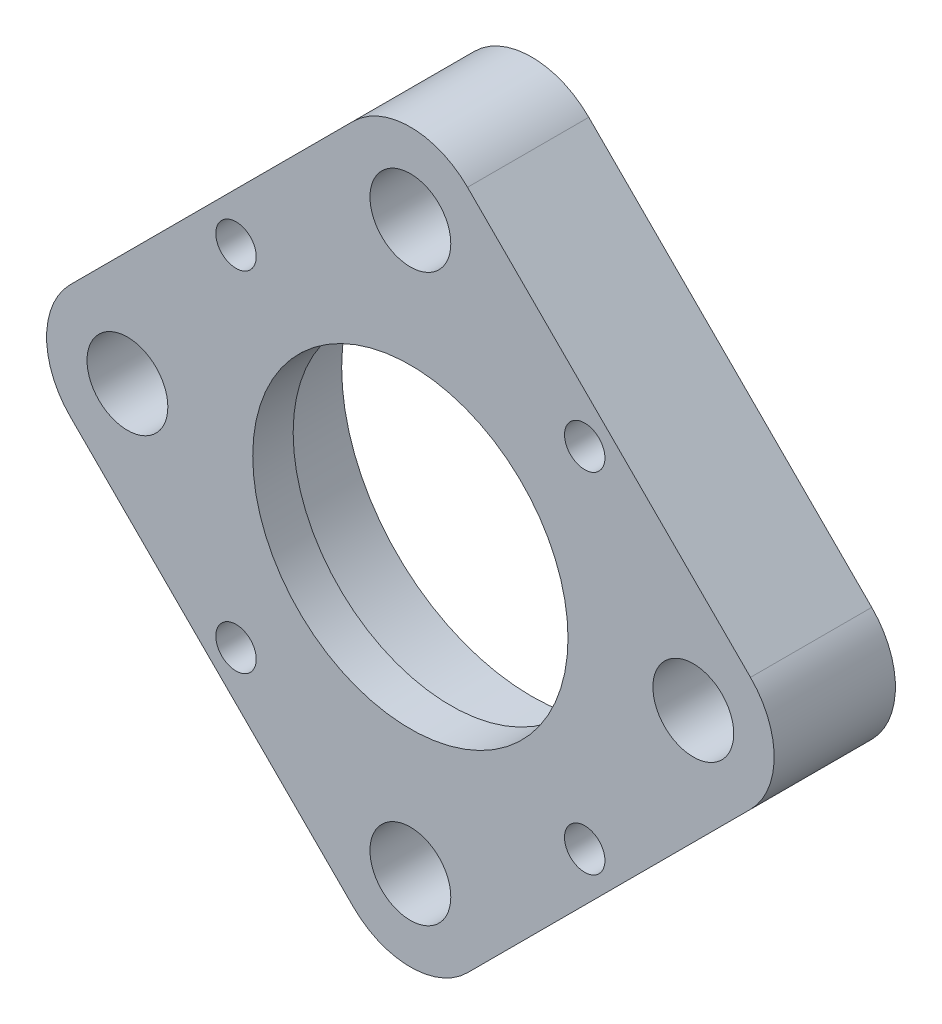
ISO-10303-21;
HEADER;
FILE_DESCRIPTION(('STEP AP214'),'2;1');
FILE_NAME('part.step','',(''),(''),'','','');
FILE_SCHEMA(('AUTOMOTIVE_DESIGN { 1 0 10303 214 1 1 1 1 }'));
ENDSEC;
DATA;
#1=APPLICATION_CONTEXT('core data for automotive mechanical design processes');
#2=APPLICATION_PROTOCOL_DEFINITION('international standard','automotive_design',2000,#1);
#3=PRODUCT_CONTEXT('',#1,'mechanical');
#4=PRODUCT('Part','Part','',(#3));
#5=PRODUCT_RELATED_PRODUCT_CATEGORY('part','',(#4));
#6=PRODUCT_DEFINITION_FORMATION('','',#4);
#7=PRODUCT_DEFINITION_CONTEXT('part definition',#1,'design');
#8=PRODUCT_DEFINITION('design','',#6,#7);
#9=PRODUCT_DEFINITION_SHAPE('','',#8);
#10=(LENGTH_UNIT() NAMED_UNIT(*) SI_UNIT(.MILLI.,.METRE.));
#11=(NAMED_UNIT(*) PLANE_ANGLE_UNIT() SI_UNIT($,.RADIAN.));
#12=(NAMED_UNIT(*) SI_UNIT($,.STERADIAN.) SOLID_ANGLE_UNIT());
#13=UNCERTAINTY_MEASURE_WITH_UNIT(LENGTH_MEASURE(1.E-05),#10,'distance_accuracy_value','');
#14=(GEOMETRIC_REPRESENTATION_CONTEXT(3) GLOBAL_UNCERTAINTY_ASSIGNED_CONTEXT((#13)) GLOBAL_UNIT_ASSIGNED_CONTEXT((#10,
#11,#12)) REPRESENTATION_CONTEXT('',''));
#15=CARTESIAN_POINT('',(0.,0.,0.));
#16=DIRECTION('',(0.,0.,1.));
#17=DIRECTION('',(1.,0.,0.));
#18=AXIS2_PLACEMENT_3D('',#15,#16,#17);
#19=CARTESIAN_POINT('',(-35.,0.,5.));
#20=DIRECTION('',(0.,0.,-1.));
#21=DIRECTION('',(-1.,0.,0.));
#22=AXIS2_PLACEMENT_3D('',#19,#20,#21);
#23=CYLINDRICAL_SURFACE('',#22,10.);
#24=CARTESIAN_POINT('',(-35.,0.,-10.));
#25=DIRECTION('',(0.,0.,-1.));
#26=DIRECTION('',(-1.,0.,0.));
#27=AXIS2_PLACEMENT_3D('',#24,#25,#26);
#28=CIRCLE('',#27,10.);
#29=CARTESIAN_POINT('',(-42.0710678118655,-7.07106781186547,-10.));
#30=VERTEX_POINT('',#29);
#31=CARTESIAN_POINT('',(-42.0710678118655,7.07106781186547,-10.));
#32=VERTEX_POINT('',#31);
#33=EDGE_CURVE('E114',#30,#32,#28,.T.);
#34=ORIENTED_EDGE('',*,*,#33,.F.);
#35=DIRECTION('',(0.,0.,-1.));
#36=VECTOR('',#35,1.);
#37=CARTESIAN_POINT('',(-42.0710678118655,-7.07106781186546,5.));
#38=LINE('',#37,#36);
#39=CARTESIAN_POINT('',(-42.0710678118655,-7.07106781186546,5.));
#40=VERTEX_POINT('',#39);
#41=EDGE_CURVE('E101',#40,#30,#38,.T.);
#42=ORIENTED_EDGE('',*,*,#41,.F.);
#43=CARTESIAN_POINT('',(-35.,0.,5.));
#44=DIRECTION('',(0.,0.,-1.));
#45=DIRECTION('',(-1.,0.,0.));
#46=AXIS2_PLACEMENT_3D('',#43,#44,#45);
#47=CIRCLE('',#46,10.);
#48=CARTESIAN_POINT('',(-42.0710678118655,7.07106781186547,5.));
#49=VERTEX_POINT('',#48);
#50=EDGE_CURVE('E112',#40,#49,#47,.T.);
#51=ORIENTED_EDGE('',*,*,#50,.T.);
#52=DIRECTION('',(0.,0.,-1.));
#53=VECTOR('',#52,1.);
#54=CARTESIAN_POINT('',(-42.0710678118655,7.07106781186547,5.));
#55=LINE('',#54,#53);
#56=EDGE_CURVE('E206',#49,#32,#55,.T.);
#57=ORIENTED_EDGE('',*,*,#56,.T.);
#58=EDGE_LOOP('',(#34,#42,#51,#57));
#59=FACE_BOUND('',#58,.T.);
#60=ADVANCED_FACE('F35',(#59),#23,.T.);
#61=CARTESIAN_POINT('',(0.,-35.,5.));
#62=DIRECTION('',(0.,0.,-1.));
#63=DIRECTION('',(-1.,0.,0.));
#64=AXIS2_PLACEMENT_3D('',#61,#62,#63);
#65=CYLINDRICAL_SURFACE('',#64,10.);
#66=DIRECTION('',(0.,0.,-1.));
#67=VECTOR('',#66,1.);
#68=CARTESIAN_POINT('',(-7.07106781186548,-42.0710678118655,5.));
#69=LINE('',#68,#67);
#70=CARTESIAN_POINT('',(-7.07106781186548,-42.0710678118655,5.));
#71=VERTEX_POINT('',#70);
#72=CARTESIAN_POINT('',(-7.07106781186548,-42.0710678118655,-10.));
#73=VERTEX_POINT('',#72);
#74=EDGE_CURVE('E104',#71,#73,#69,.T.);
#75=ORIENTED_EDGE('',*,*,#74,.T.);
#76=CARTESIAN_POINT('',(0.,-35.,-10.));
#77=DIRECTION('',(0.,0.,-1.));
#78=DIRECTION('',(-1.,0.,0.));
#79=AXIS2_PLACEMENT_3D('',#76,#77,#78);
#80=CIRCLE('',#79,10.);
#81=CARTESIAN_POINT('',(7.07106781186547,-42.0710678118655,-10.));
#82=VERTEX_POINT('',#81);
#83=EDGE_CURVE('E131',#82,#73,#80,.T.);
#84=ORIENTED_EDGE('',*,*,#83,.F.);
#85=DIRECTION('',(0.,0.,-1.));
#86=VECTOR('',#85,1.);
#87=CARTESIAN_POINT('',(7.07106781186546,-42.0710678118655,5.));
#88=LINE('',#87,#86);
#89=CARTESIAN_POINT('',(7.07106781186546,-42.0710678118655,5.));
#90=VERTEX_POINT('',#89);
#91=EDGE_CURVE('E572',#90,#82,#88,.T.);
#92=ORIENTED_EDGE('',*,*,#91,.F.);
#93=CARTESIAN_POINT('',(0.,-35.,5.));
#94=DIRECTION('',(0.,0.,-1.));
#95=DIRECTION('',(-1.,0.,0.));
#96=AXIS2_PLACEMENT_3D('',#93,#94,#95);
#97=CIRCLE('',#96,10.);
#98=EDGE_CURVE('E133',#90,#71,#97,.T.);
#99=ORIENTED_EDGE('',*,*,#98,.T.);
#100=EDGE_LOOP('',(#75,#84,#92,#99));
#101=FACE_BOUND('',#100,.T.);
#102=ADVANCED_FACE('F164',(#101),#65,.T.);
#103=CARTESIAN_POINT('',(35.,0.,5.));
#104=DIRECTION('',(0.,0.,-1.));
#105=DIRECTION('',(-1.,0.,0.));
#106=AXIS2_PLACEMENT_3D('',#103,#104,#105);
#107=CYLINDRICAL_SURFACE('',#106,10.);
#108=DIRECTION('',(0.,0.,-1.));
#109=VECTOR('',#108,1.);
#110=CARTESIAN_POINT('',(42.0710678118655,-7.07106781186546,5.));
#111=LINE('',#110,#109);
#112=CARTESIAN_POINT('',(42.0710678118655,-7.07106781186546,5.));
#113=VERTEX_POINT('',#112);
#114=CARTESIAN_POINT('',(42.0710678118655,-7.07106781186546,-10.));
#115=VERTEX_POINT('',#114);
#116=EDGE_CURVE('E570',#113,#115,#111,.T.);
#117=ORIENTED_EDGE('',*,*,#116,.T.);
#118=CARTESIAN_POINT('',(35.,0.,-10.));
#119=DIRECTION('',(0.,0.,-1.));
#120=DIRECTION('',(-1.,0.,0.));
#121=AXIS2_PLACEMENT_3D('',#118,#119,#120);
#122=CIRCLE('',#121,10.);
#123=CARTESIAN_POINT('',(42.0710678118655,7.07106781186548,-10.));
#124=VERTEX_POINT('',#123);
#125=EDGE_CURVE('E121',#124,#115,#122,.T.);
#126=ORIENTED_EDGE('',*,*,#125,.F.);
#127=DIRECTION('',(0.,0.,-1.));
#128=VECTOR('',#127,1.);
#129=CARTESIAN_POINT('',(42.0710678118655,7.07106781186547,5.));
#130=LINE('',#129,#128);
#131=CARTESIAN_POINT('',(42.0710678118655,7.07106781186547,5.));
#132=VERTEX_POINT('',#131);
#133=EDGE_CURVE('E579',#132,#124,#130,.T.);
#134=ORIENTED_EDGE('',*,*,#133,.F.);
#135=CARTESIAN_POINT('',(35.,0.,5.));
#136=DIRECTION('',(0.,0.,-1.));
#137=DIRECTION('',(-1.,0.,0.));
#138=AXIS2_PLACEMENT_3D('',#135,#136,#137);
#139=CIRCLE('',#138,10.);
#140=EDGE_CURVE('E123',#132,#113,#139,.T.);
#141=ORIENTED_EDGE('',*,*,#140,.T.);
#142=EDGE_LOOP('',(#117,#126,#134,#141));
#143=FACE_BOUND('',#142,.T.);
#144=ADVANCED_FACE('F169',(#143),#107,.T.);
#145=CARTESIAN_POINT('',(0.,35.,5.));
#146=DIRECTION('',(0.,0.,-1.));
#147=DIRECTION('',(-1.,0.,0.));
#148=AXIS2_PLACEMENT_3D('',#145,#146,#147);
#149=CYLINDRICAL_SURFACE('',#148,10.);
#150=DIRECTION('',(0.,0.,-1.));
#151=VECTOR('',#150,1.);
#152=CARTESIAN_POINT('',(7.07106781186546,42.0710678118655,5.));
#153=LINE('',#152,#151);
#154=CARTESIAN_POINT('',(7.07106781186546,42.0710678118655,5.));
#155=VERTEX_POINT('',#154);
#156=CARTESIAN_POINT('',(7.07106781186546,42.0710678118655,-10.));
#157=VERTEX_POINT('',#156);
#158=EDGE_CURVE('E188',#155,#157,#153,.T.);
#159=ORIENTED_EDGE('',*,*,#158,.T.);
#160=CARTESIAN_POINT('',(0.,35.,-10.));
#161=DIRECTION('',(0.,0.,-1.));
#162=DIRECTION('',(-1.,0.,0.));
#163=AXIS2_PLACEMENT_3D('',#160,#161,#162);
#164=CIRCLE('',#163,10.);
#165=CARTESIAN_POINT('',(-7.07106781186547,42.0710678118655,-10.));
#166=VERTEX_POINT('',#165);
#167=EDGE_CURVE('E135',#166,#157,#164,.T.);
#168=ORIENTED_EDGE('',*,*,#167,.F.);
#169=DIRECTION('',(0.,0.,-1.));
#170=VECTOR('',#169,1.);
#171=CARTESIAN_POINT('',(-7.07106781186546,42.0710678118655,5.));
#172=LINE('',#171,#170);
#173=CARTESIAN_POINT('',(-7.07106781186546,42.0710678118655,5.));
#174=VERTEX_POINT('',#173);
#175=EDGE_CURVE('E191',#174,#166,#172,.T.);
#176=ORIENTED_EDGE('',*,*,#175,.F.);
#177=CARTESIAN_POINT('',(0.,35.,5.));
#178=DIRECTION('',(0.,0.,-1.));
#179=DIRECTION('',(-1.,0.,0.));
#180=AXIS2_PLACEMENT_3D('',#177,#178,#179);
#181=CIRCLE('',#180,10.);
#182=EDGE_CURVE('E137',#174,#155,#181,.T.);
#183=ORIENTED_EDGE('',*,*,#182,.T.);
#184=EDGE_LOOP('',(#159,#168,#176,#183));
#185=FACE_BOUND('',#184,.T.);
#186=ADVANCED_FACE('F176',(#185),#149,.T.);
#187=CARTESIAN_POINT('',(0.,0.,0.));
#188=DIRECTION('',(0.,0.,1.));
#189=DIRECTION('',(1.,0.,0.));
#190=AXIS2_PLACEMENT_3D('',#187,#188,#189);
#191=PLANE('',#190);
#192=CARTESIAN_POINT('',(0.,0.,0.));
#193=DIRECTION('',(0.,0.,1.));
#194=DIRECTION('',(1.,0.,0.));
#195=AXIS2_PLACEMENT_3D('',#192,#193,#194);
#196=CIRCLE('',#195,19.5);
#197=CARTESIAN_POINT('',(19.5,0.,0.));
#198=VERTEX_POINT('',#197);
#199=EDGE_CURVE('E39',#198,#198,#196,.T.);
#200=ORIENTED_EDGE('',*,*,#199,.T.);
#201=EDGE_LOOP('',(#200));
#202=FACE_BOUND('',#201,.T.);
#203=CARTESIAN_POINT('',(0.,0.,0.));
#204=DIRECTION('',(0.,0.,-1.));
#205=DIRECTION('',(-1.,0.,0.));
#206=AXIS2_PLACEMENT_3D('',#203,#204,#205);
#207=CIRCLE('',#206,23.5);
#208=CARTESIAN_POINT('',(-23.5,0.,0.));
#209=VERTEX_POINT('',#208);
#210=EDGE_CURVE('E140',#209,#209,#207,.T.);
#211=ORIENTED_EDGE('',*,*,#210,.T.);
#212=EDGE_LOOP('',(#211));
#213=FACE_BOUND('',#212,.T.);
#214=ADVANCED_FACE('F149',(#202,#213),#191,.F.);
#215=CARTESIAN_POINT('',(0.,0.,5.));
#216=DIRECTION('',(0.,0.,-1.));
#217=DIRECTION('',(-1.,0.,0.));
#218=AXIS2_PLACEMENT_3D('',#215,#216,#217);
#219=CYLINDRICAL_SURFACE('',#218,19.5);
#220=CARTESIAN_POINT('',(0.,0.,5.));
#221=DIRECTION('',(0.,0.,1.));
#222=DIRECTION('',(1.,0.,0.));
#223=AXIS2_PLACEMENT_3D('',#220,#221,#222);
#224=CIRCLE('',#223,19.5);
#225=CARTESIAN_POINT('',(19.5,0.,5.));
#226=VERTEX_POINT('',#225);
#227=EDGE_CURVE('E12',#226,#226,#224,.T.);
#228=ORIENTED_EDGE('',*,*,#227,.T.);
#229=EDGE_LOOP('',(#228));
#230=FACE_BOUND('',#229,.T.);
#231=ORIENTED_EDGE('',*,*,#199,.F.);
#232=EDGE_LOOP('',(#231));
#233=FACE_BOUND('',#232,.T.);
#234=ADVANCED_FACE('F37',(#230,#233),#219,.F.);
#235=CARTESIAN_POINT('',(0.,0.,5.));
#236=DIRECTION('',(0.,0.,1.));
#237=DIRECTION('',(1.,0.,0.));
#238=AXIS2_PLACEMENT_3D('',#235,#236,#237);
#239=PLANE('',#238);
#240=ORIENTED_EDGE('',*,*,#182,.F.);
#241=DIRECTION('',(-0.707106781186548,-0.707106781186547,0.));
#242=VECTOR('',#241,1.);
#243=CARTESIAN_POINT('',(-24.5710678118655,24.5710678118655,5.));
#244=LINE('',#243,#242);
#245=EDGE_CURVE('E119',#174,#49,#244,.T.);
#246=ORIENTED_EDGE('',*,*,#245,.T.);
#247=ORIENTED_EDGE('',*,*,#50,.F.);
#248=DIRECTION('',(0.707106781186547,-0.707106781186548,0.));
#249=VECTOR('',#248,1.);
#250=CARTESIAN_POINT('',(-24.5710678118655,-24.5710678118655,5.));
#251=LINE('',#250,#249);
#252=EDGE_CURVE('E98',#40,#71,#251,.T.);
#253=ORIENTED_EDGE('',*,*,#252,.T.);
#254=ORIENTED_EDGE('',*,*,#98,.F.);
#255=DIRECTION('',(0.707106781186548,0.707106781186548,0.));
#256=VECTOR('',#255,1.);
#257=CARTESIAN_POINT('',(24.5710678118655,-24.5710678118655,5.));
#258=LINE('',#257,#256);
#259=EDGE_CURVE('E574',#90,#113,#258,.T.);
#260=ORIENTED_EDGE('',*,*,#259,.T.);
#261=ORIENTED_EDGE('',*,*,#140,.F.);
#262=DIRECTION('',(-0.707106781186548,0.707106781186547,0.));
#263=VECTOR('',#262,1.);
#264=CARTESIAN_POINT('',(24.5710678118655,24.5710678118655,5.));
#265=LINE('',#264,#263);
#266=EDGE_CURVE('E192',#132,#155,#265,.T.);
#267=ORIENTED_EDGE('',*,*,#266,.T.);
#268=EDGE_LOOP('',(#240,#246,#247,#253,#254,#260,#261,#267));
#269=FACE_BOUND('',#268,.T.);
#270=CARTESIAN_POINT('',(-21.5667568261898,21.5667568261896,5.));
#271=DIRECTION('',(0.,0.,1.));
#272=DIRECTION('',(1.,0.,0.));
#273=AXIS2_PLACEMENT_3D('',#270,#271,#272);
#274=CIRCLE('',#273,2.49999999999999);
#275=CARTESIAN_POINT('',(-19.0667568261898,21.5667568261896,5.));
#276=VERTEX_POINT('',#275);
#277=EDGE_CURVE('E209',#276,#276,#274,.T.);
#278=ORIENTED_EDGE('',*,*,#277,.F.);
#279=EDGE_LOOP('',(#278));
#280=FACE_BOUND('',#279,.T.);
#281=CARTESIAN_POINT('',(21.5667568261898,21.5667568261896,5.));
#282=DIRECTION('',(0.,0.,1.));
#283=DIRECTION('',(1.,0.,0.));
#284=AXIS2_PLACEMENT_3D('',#281,#282,#283);
#285=CIRCLE('',#284,2.49999999999999);
#286=CARTESIAN_POINT('',(24.0667568261898,21.5667568261896,5.));
#287=VERTEX_POINT('',#286);
#288=EDGE_CURVE('E215',#287,#287,#285,.T.);
#289=ORIENTED_EDGE('',*,*,#288,.F.);
#290=EDGE_LOOP('',(#289));
#291=FACE_BOUND('',#290,.T.);
#292=CARTESIAN_POINT('',(21.5667568261898,-21.5667568261896,5.));
#293=DIRECTION('',(0.,0.,1.));
#294=DIRECTION('',(1.,0.,0.));
#295=AXIS2_PLACEMENT_3D('',#292,#293,#294);
#296=CIRCLE('',#295,2.49999999999999);
#297=CARTESIAN_POINT('',(24.0667568261898,-21.5667568261896,5.));
#298=VERTEX_POINT('',#297);
#299=EDGE_CURVE('E221',#298,#298,#296,.T.);
#300=ORIENTED_EDGE('',*,*,#299,.F.);
#301=EDGE_LOOP('',(#300));
#302=FACE_BOUND('',#301,.T.);
#303=CARTESIAN_POINT('',(-21.5667568261898,-21.5667568261896,5.));
#304=DIRECTION('',(0.,0.,1.));
#305=DIRECTION('',(1.,0.,0.));
#306=AXIS2_PLACEMENT_3D('',#303,#304,#305);
#307=CIRCLE('',#306,2.49999999999999);
#308=CARTESIAN_POINT('',(-19.0667568261898,-21.5667568261896,5.));
#309=VERTEX_POINT('',#308);
#310=EDGE_CURVE('E227',#309,#309,#307,.T.);
#311=ORIENTED_EDGE('',*,*,#310,.F.);
#312=EDGE_LOOP('',(#311));
#313=FACE_BOUND('',#312,.T.);
#314=CARTESIAN_POINT('',(0.,35.,5.));
#315=DIRECTION('',(0.,0.,1.));
#316=DIRECTION('',(1.,0.,0.));
#317=AXIS2_PLACEMENT_3D('',#314,#315,#316);
#318=CIRCLE('',#317,5.);
#319=CARTESIAN_POINT('',(5.,35.,5.));
#320=VERTEX_POINT('',#319);
#321=EDGE_CURVE('E233',#320,#320,#318,.T.);
#322=ORIENTED_EDGE('',*,*,#321,.F.);
#323=EDGE_LOOP('',(#322));
#324=FACE_BOUND('',#323,.T.);
#325=CARTESIAN_POINT('',(0.,-35.,5.));
#326=DIRECTION('',(0.,0.,1.));
#327=DIRECTION('',(1.,0.,0.));
#328=AXIS2_PLACEMENT_3D('',#325,#326,#327);
#329=CIRCLE('',#328,5.);
#330=CARTESIAN_POINT('',(5.,-35.,5.));
#331=VERTEX_POINT('',#330);
#332=EDGE_CURVE('E239',#331,#331,#329,.T.);
#333=ORIENTED_EDGE('',*,*,#332,.F.);
#334=EDGE_LOOP('',(#333));
#335=FACE_BOUND('',#334,.T.);
#336=CARTESIAN_POINT('',(-35.,0.,5.));
#337=DIRECTION('',(0.,0.,1.));
#338=DIRECTION('',(1.,0.,0.));
#339=AXIS2_PLACEMENT_3D('',#336,#337,#338);
#340=CIRCLE('',#339,5.);
#341=CARTESIAN_POINT('',(-30.,0.,5.));
#342=VERTEX_POINT('',#341);
#343=EDGE_CURVE('E245',#342,#342,#340,.T.);
#344=ORIENTED_EDGE('',*,*,#343,.F.);
#345=EDGE_LOOP('',(#344));
#346=FACE_BOUND('',#345,.T.);
#347=CARTESIAN_POINT('',(35.,0.,5.));
#348=DIRECTION('',(0.,0.,1.));
#349=DIRECTION('',(1.,0.,0.));
#350=AXIS2_PLACEMENT_3D('',#347,#348,#349);
#351=CIRCLE('',#350,5.);
#352=CARTESIAN_POINT('',(40.,0.,5.));
#353=VERTEX_POINT('',#352);
#354=EDGE_CURVE('E250',#353,#353,#351,.T.);
#355=ORIENTED_EDGE('',*,*,#354,.F.);
#356=EDGE_LOOP('',(#355));
#357=FACE_BOUND('',#356,.T.);
#358=ORIENTED_EDGE('',*,*,#227,.F.);
#359=EDGE_LOOP('',(#358));
#360=FACE_BOUND('',#359,.T.);
#361=ADVANCED_FACE('F117',(#269,#280,#291,#302,#313,#324,#335,#346,#357,#360),#239,.T.);
#362=CARTESIAN_POINT('',(0.,0.,-10.));
#363=DIRECTION('',(0.,0.,1.));
#364=DIRECTION('',(1.,0.,0.));
#365=AXIS2_PLACEMENT_3D('',#362,#363,#364);
#366=CYLINDRICAL_SURFACE('',#365,23.5);
#367=CARTESIAN_POINT('',(0.,0.,-10.));
#368=DIRECTION('',(0.,0.,-1.));
#369=DIRECTION('',(-1.,0.,0.));
#370=AXIS2_PLACEMENT_3D('',#367,#368,#369);
#371=CIRCLE('',#370,23.5);
#372=CARTESIAN_POINT('',(-23.5,0.,-10.));
#373=VERTEX_POINT('',#372);
#374=EDGE_CURVE('E143',#373,#373,#371,.T.);
#375=ORIENTED_EDGE('',*,*,#374,.T.);
#376=EDGE_LOOP('',(#375));
#377=FACE_BOUND('',#376,.T.);
#378=ORIENTED_EDGE('',*,*,#210,.F.);
#379=EDGE_LOOP('',(#378));
#380=FACE_BOUND('',#379,.T.);
#381=ADVANCED_FACE('F151',(#377,#380),#366,.F.);
#382=CARTESIAN_POINT('',(0.,0.,-10.));
#383=DIRECTION('',(0.,0.,-1.));
#384=DIRECTION('',(-1.,0.,0.));
#385=AXIS2_PLACEMENT_3D('',#382,#383,#384);
#386=PLANE('',#385);
#387=DIRECTION('',(-0.707106781186548,-0.707106781186547,0.));
#388=VECTOR('',#387,1.);
#389=CARTESIAN_POINT('',(-24.5710678118655,24.5710678118655,-10.));
#390=LINE('',#389,#388);
#391=EDGE_CURVE('E198',#166,#32,#390,.T.);
#392=ORIENTED_EDGE('',*,*,#391,.F.);
#393=ORIENTED_EDGE('',*,*,#167,.T.);
#394=DIRECTION('',(-0.707106781186548,0.707106781186547,0.));
#395=VECTOR('',#394,1.);
#396=CARTESIAN_POINT('',(24.5710678118655,24.5710678118655,-10.));
#397=LINE('',#396,#395);
#398=EDGE_CURVE('E195',#124,#157,#397,.T.);
#399=ORIENTED_EDGE('',*,*,#398,.F.);
#400=ORIENTED_EDGE('',*,*,#125,.T.);
#401=DIRECTION('',(0.707106781186548,0.707106781186548,0.));
#402=VECTOR('',#401,1.);
#403=CARTESIAN_POINT('',(24.5710678118655,-24.5710678118655,-10.));
#404=LINE('',#403,#402);
#405=EDGE_CURVE('E56',#82,#115,#404,.T.);
#406=ORIENTED_EDGE('',*,*,#405,.F.);
#407=ORIENTED_EDGE('',*,*,#83,.T.);
#408=DIRECTION('',(0.707106781186547,-0.707106781186548,0.));
#409=VECTOR('',#408,1.);
#410=CARTESIAN_POINT('',(-24.5710678118655,-24.5710678118655,-10.));
#411=LINE('',#410,#409);
#412=EDGE_CURVE('E50',#30,#73,#411,.T.);
#413=ORIENTED_EDGE('',*,*,#412,.F.);
#414=ORIENTED_EDGE('',*,*,#33,.T.);
#415=EDGE_LOOP('',(#392,#393,#399,#400,#406,#407,#413,#414));
#416=FACE_BOUND('',#415,.T.);
#417=CARTESIAN_POINT('',(-21.5667568261898,21.5667568261896,-10.));
#418=DIRECTION('',(0.,0.,1.));
#419=DIRECTION('',(1.,0.,0.));
#420=AXIS2_PLACEMENT_3D('',#417,#418,#419);
#421=CIRCLE('',#420,2.5);
#422=CARTESIAN_POINT('',(-19.0667568261898,21.5667568261896,-10.));
#423=VERTEX_POINT('',#422);
#424=EDGE_CURVE('E212',#423,#423,#421,.T.);
#425=ORIENTED_EDGE('',*,*,#424,.T.);
#426=EDGE_LOOP('',(#425));
#427=FACE_BOUND('',#426,.T.);
#428=CARTESIAN_POINT('',(21.5667568261898,21.5667568261896,-10.));
#429=DIRECTION('',(0.,0.,1.));
#430=DIRECTION('',(1.,0.,0.));
#431=AXIS2_PLACEMENT_3D('',#428,#429,#430);
#432=CIRCLE('',#431,2.5);
#433=CARTESIAN_POINT('',(24.0667568261898,21.5667568261896,-10.));
#434=VERTEX_POINT('',#433);
#435=EDGE_CURVE('E218',#434,#434,#432,.T.);
#436=ORIENTED_EDGE('',*,*,#435,.T.);
#437=EDGE_LOOP('',(#436));
#438=FACE_BOUND('',#437,.T.);
#439=CARTESIAN_POINT('',(21.5667568261898,-21.5667568261896,-10.));
#440=DIRECTION('',(0.,0.,1.));
#441=DIRECTION('',(1.,0.,0.));
#442=AXIS2_PLACEMENT_3D('',#439,#440,#441);
#443=CIRCLE('',#442,2.5);
#444=CARTESIAN_POINT('',(24.0667568261898,-21.5667568261896,-10.));
#445=VERTEX_POINT('',#444);
#446=EDGE_CURVE('E224',#445,#445,#443,.T.);
#447=ORIENTED_EDGE('',*,*,#446,.T.);
#448=EDGE_LOOP('',(#447));
#449=FACE_BOUND('',#448,.T.);
#450=CARTESIAN_POINT('',(-21.5667568261898,-21.5667568261896,-10.));
#451=DIRECTION('',(0.,0.,1.));
#452=DIRECTION('',(1.,0.,0.));
#453=AXIS2_PLACEMENT_3D('',#450,#451,#452);
#454=CIRCLE('',#453,2.5);
#455=CARTESIAN_POINT('',(-19.0667568261898,-21.5667568261896,-10.));
#456=VERTEX_POINT('',#455);
#457=EDGE_CURVE('E230',#456,#456,#454,.T.);
#458=ORIENTED_EDGE('',*,*,#457,.T.);
#459=EDGE_LOOP('',(#458));
#460=FACE_BOUND('',#459,.T.);
#461=CARTESIAN_POINT('',(0.,35.,-10.));
#462=DIRECTION('',(0.,0.,1.));
#463=DIRECTION('',(1.,0.,0.));
#464=AXIS2_PLACEMENT_3D('',#461,#462,#463);
#465=CIRCLE('',#464,5.);
#466=CARTESIAN_POINT('',(5.,35.,-10.));
#467=VERTEX_POINT('',#466);
#468=EDGE_CURVE('E236',#467,#467,#465,.T.);
#469=ORIENTED_EDGE('',*,*,#468,.T.);
#470=EDGE_LOOP('',(#469));
#471=FACE_BOUND('',#470,.T.);
#472=CARTESIAN_POINT('',(0.,-35.,-10.));
#473=DIRECTION('',(0.,0.,1.));
#474=DIRECTION('',(1.,0.,0.));
#475=AXIS2_PLACEMENT_3D('',#472,#473,#474);
#476=CIRCLE('',#475,5.);
#477=CARTESIAN_POINT('',(5.,-35.,-10.));
#478=VERTEX_POINT('',#477);
#479=EDGE_CURVE('E242',#478,#478,#476,.T.);
#480=ORIENTED_EDGE('',*,*,#479,.T.);
#481=EDGE_LOOP('',(#480));
#482=FACE_BOUND('',#481,.T.);
#483=CARTESIAN_POINT('',(-35.,0.,-10.));
#484=DIRECTION('',(0.,0.,1.));
#485=DIRECTION('',(1.,0.,0.));
#486=AXIS2_PLACEMENT_3D('',#483,#484,#485);
#487=CIRCLE('',#486,5.);
#488=CARTESIAN_POINT('',(-30.,0.,-10.));
#489=VERTEX_POINT('',#488);
#490=EDGE_CURVE('E248',#489,#489,#487,.T.);
#491=ORIENTED_EDGE('',*,*,#490,.T.);
#492=EDGE_LOOP('',(#491));
#493=FACE_BOUND('',#492,.T.);
#494=CARTESIAN_POINT('',(35.,0.,-10.));
#495=DIRECTION('',(0.,0.,1.));
#496=DIRECTION('',(1.,0.,0.));
#497=AXIS2_PLACEMENT_3D('',#494,#495,#496);
#498=CIRCLE('',#497,5.);
#499=CARTESIAN_POINT('',(40.,0.,-10.));
#500=VERTEX_POINT('',#499);
#501=EDGE_CURVE('E125',#500,#500,#498,.T.);
#502=ORIENTED_EDGE('',*,*,#501,.T.);
#503=EDGE_LOOP('',(#502));
#504=FACE_BOUND('',#503,.T.);
#505=ORIENTED_EDGE('',*,*,#374,.F.);
#506=EDGE_LOOP('',(#505));
#507=FACE_BOUND('',#506,.T.);
#508=ADVANCED_FACE('F153',(#416,#427,#438,#449,#460,#471,#482,#493,#504,#507),#386,.T.);
#509=CARTESIAN_POINT('',(35.,0.,5.));
#510=DIRECTION('',(0.,0.,1.));
#511=DIRECTION('',(1.,0.,0.));
#512=AXIS2_PLACEMENT_3D('',#509,#510,#511);
#513=CYLINDRICAL_SURFACE('',#512,5.);
#514=ORIENTED_EDGE('',*,*,#501,.F.);
#515=EDGE_LOOP('',(#514));
#516=FACE_BOUND('',#515,.T.);
#517=ORIENTED_EDGE('',*,*,#354,.T.);
#518=EDGE_LOOP('',(#517));
#519=FACE_BOUND('',#518,.T.);
#520=ADVANCED_FACE('F160',(#516,#519),#513,.F.);
#521=CARTESIAN_POINT('',(-35.,0.,5.));
#522=DIRECTION('',(0.,0.,1.));
#523=DIRECTION('',(1.,0.,0.));
#524=AXIS2_PLACEMENT_3D('',#521,#522,#523);
#525=CYLINDRICAL_SURFACE('',#524,5.);
#526=ORIENTED_EDGE('',*,*,#490,.F.);
#527=EDGE_LOOP('',(#526));
#528=FACE_BOUND('',#527,.T.);
#529=ORIENTED_EDGE('',*,*,#343,.T.);
#530=EDGE_LOOP('',(#529));
#531=FACE_BOUND('',#530,.T.);
#532=ADVANCED_FACE('F260',(#528,#531),#525,.F.);
#533=CARTESIAN_POINT('',(0.,-35.,5.));
#534=DIRECTION('',(0.,0.,1.));
#535=DIRECTION('',(1.,0.,0.));
#536=AXIS2_PLACEMENT_3D('',#533,#534,#535);
#537=CYLINDRICAL_SURFACE('',#536,5.);
#538=ORIENTED_EDGE('',*,*,#479,.F.);
#539=EDGE_LOOP('',(#538));
#540=FACE_BOUND('',#539,.T.);
#541=ORIENTED_EDGE('',*,*,#332,.T.);
#542=EDGE_LOOP('',(#541));
#543=FACE_BOUND('',#542,.T.);
#544=ADVANCED_FACE('F264',(#540,#543),#537,.F.);
#545=CARTESIAN_POINT('',(0.,35.,5.));
#546=DIRECTION('',(0.,0.,1.));
#547=DIRECTION('',(1.,0.,0.));
#548=AXIS2_PLACEMENT_3D('',#545,#546,#547);
#549=CYLINDRICAL_SURFACE('',#548,5.);
#550=ORIENTED_EDGE('',*,*,#468,.F.);
#551=EDGE_LOOP('',(#550));
#552=FACE_BOUND('',#551,.T.);
#553=ORIENTED_EDGE('',*,*,#321,.T.);
#554=EDGE_LOOP('',(#553));
#555=FACE_BOUND('',#554,.T.);
#556=ADVANCED_FACE('F269',(#552,#555),#549,.F.);
#557=CARTESIAN_POINT('',(-21.5667568261898,-21.5667568261896,5.));
#558=DIRECTION('',(0.,0.,1.));
#559=DIRECTION('',(1.,0.,0.));
#560=AXIS2_PLACEMENT_3D('',#557,#558,#559);
#561=CYLINDRICAL_SURFACE('',#560,2.49999999999999);
#562=ORIENTED_EDGE('',*,*,#457,.F.);
#563=EDGE_LOOP('',(#562));
#564=FACE_BOUND('',#563,.T.);
#565=ORIENTED_EDGE('',*,*,#310,.T.);
#566=EDGE_LOOP('',(#565));
#567=FACE_BOUND('',#566,.T.);
#568=ADVANCED_FACE('F277',(#564,#567),#561,.F.);
#569=CARTESIAN_POINT('',(21.5667568261898,-21.5667568261896,5.));
#570=DIRECTION('',(0.,0.,1.));
#571=DIRECTION('',(1.,0.,0.));
#572=AXIS2_PLACEMENT_3D('',#569,#570,#571);
#573=CYLINDRICAL_SURFACE('',#572,2.49999999999999);
#574=ORIENTED_EDGE('',*,*,#446,.F.);
#575=EDGE_LOOP('',(#574));
#576=FACE_BOUND('',#575,.T.);
#577=ORIENTED_EDGE('',*,*,#299,.T.);
#578=EDGE_LOOP('',(#577));
#579=FACE_BOUND('',#578,.T.);
#580=ADVANCED_FACE('F281',(#576,#579),#573,.F.);
#581=CARTESIAN_POINT('',(21.5667568261898,21.5667568261896,5.));
#582=DIRECTION('',(0.,0.,1.));
#583=DIRECTION('',(1.,0.,0.));
#584=AXIS2_PLACEMENT_3D('',#581,#582,#583);
#585=CYLINDRICAL_SURFACE('',#584,2.49999999999999);
#586=ORIENTED_EDGE('',*,*,#435,.F.);
#587=EDGE_LOOP('',(#586));
#588=FACE_BOUND('',#587,.T.);
#589=ORIENTED_EDGE('',*,*,#288,.T.);
#590=EDGE_LOOP('',(#589));
#591=FACE_BOUND('',#590,.T.);
#592=ADVANCED_FACE('F285',(#588,#591),#585,.F.);
#593=CARTESIAN_POINT('',(-21.5667568261898,21.5667568261896,5.));
#594=DIRECTION('',(0.,0.,1.));
#595=DIRECTION('',(1.,0.,0.));
#596=AXIS2_PLACEMENT_3D('',#593,#594,#595);
#597=CYLINDRICAL_SURFACE('',#596,2.49999999999999);
#598=ORIENTED_EDGE('',*,*,#424,.F.);
#599=EDGE_LOOP('',(#598));
#600=FACE_BOUND('',#599,.T.);
#601=ORIENTED_EDGE('',*,*,#277,.T.);
#602=EDGE_LOOP('',(#601));
#603=FACE_BOUND('',#602,.T.);
#604=ADVANCED_FACE('F289',(#600,#603),#597,.F.);
#605=CARTESIAN_POINT('',(-24.5710678118655,24.5710678118655,5.));
#606=DIRECTION('',(0.707106781186547,-0.707106781186548,0.));
#607=DIRECTION('',(0.707106781186548,0.707106781186547,0.));
#608=AXIS2_PLACEMENT_3D('',#605,#606,#607);
#609=PLANE('',#608);
#610=ORIENTED_EDGE('',*,*,#391,.T.);
#611=ORIENTED_EDGE('',*,*,#56,.F.);
#612=ORIENTED_EDGE('',*,*,#245,.F.);
#613=ORIENTED_EDGE('',*,*,#175,.T.);
#614=EDGE_LOOP('',(#610,#611,#612,#613));
#615=FACE_BOUND('',#614,.T.);
#616=ADVANCED_FACE('F202',(#615),#609,.F.);
#617=CARTESIAN_POINT('',(24.5710678118655,24.5710678118655,5.));
#618=DIRECTION('',(-0.707106781186547,-0.707106781186548,0.));
#619=DIRECTION('',(0.707106781186548,-0.707106781186547,0.));
#620=AXIS2_PLACEMENT_3D('',#617,#618,#619);
#621=PLANE('',#620);
#622=ORIENTED_EDGE('',*,*,#398,.T.);
#623=ORIENTED_EDGE('',*,*,#158,.F.);
#624=ORIENTED_EDGE('',*,*,#266,.F.);
#625=ORIENTED_EDGE('',*,*,#133,.T.);
#626=EDGE_LOOP('',(#622,#623,#624,#625));
#627=FACE_BOUND('',#626,.T.);
#628=ADVANCED_FACE('F296',(#627),#621,.F.);
#629=CARTESIAN_POINT('',(24.5710678118655,-24.5710678118655,5.));
#630=DIRECTION('',(-0.707106781186547,0.707106781186547,0.));
#631=DIRECTION('',(-0.707106781186548,-0.707106781186548,0.));
#632=AXIS2_PLACEMENT_3D('',#629,#630,#631);
#633=PLANE('',#632);
#634=ORIENTED_EDGE('',*,*,#405,.T.);
#635=ORIENTED_EDGE('',*,*,#116,.F.);
#636=ORIENTED_EDGE('',*,*,#259,.F.);
#637=ORIENTED_EDGE('',*,*,#91,.T.);
#638=EDGE_LOOP('',(#634,#635,#636,#637));
#639=FACE_BOUND('',#638,.T.);
#640=ADVANCED_FACE('F299',(#639),#633,.F.);
#641=CARTESIAN_POINT('',(-24.5710678118655,-24.5710678118655,5.));
#642=DIRECTION('',(0.707106781186548,0.707106781186547,0.));
#643=DIRECTION('',(-0.707106781186547,0.707106781186548,0.));
#644=AXIS2_PLACEMENT_3D('',#641,#642,#643);
#645=PLANE('',#644);
#646=ORIENTED_EDGE('',*,*,#412,.T.);
#647=ORIENTED_EDGE('',*,*,#74,.F.);
#648=ORIENTED_EDGE('',*,*,#252,.F.);
#649=ORIENTED_EDGE('',*,*,#41,.T.);
#650=EDGE_LOOP('',(#646,#647,#648,#649));
#651=FACE_BOUND('',#650,.T.);
#652=ADVANCED_FACE('F100',(#651),#645,.F.);
#653=CLOSED_SHELL('',(#60,#102,#144,#186,#214,#234,#361,#381,#508,#520,#532,#544,#556,#568,#580,
#592,#604,#616,#628,#640,#652));
#654=MANIFOLD_SOLID_BREP('B2',#653);
#655=ADVANCED_BREP_SHAPE_REPRESENTATION('',(#18,#654),#14);
#656=SHAPE_DEFINITION_REPRESENTATION(#9,#655);
ENDSEC;
END-ISO-10303-21;
